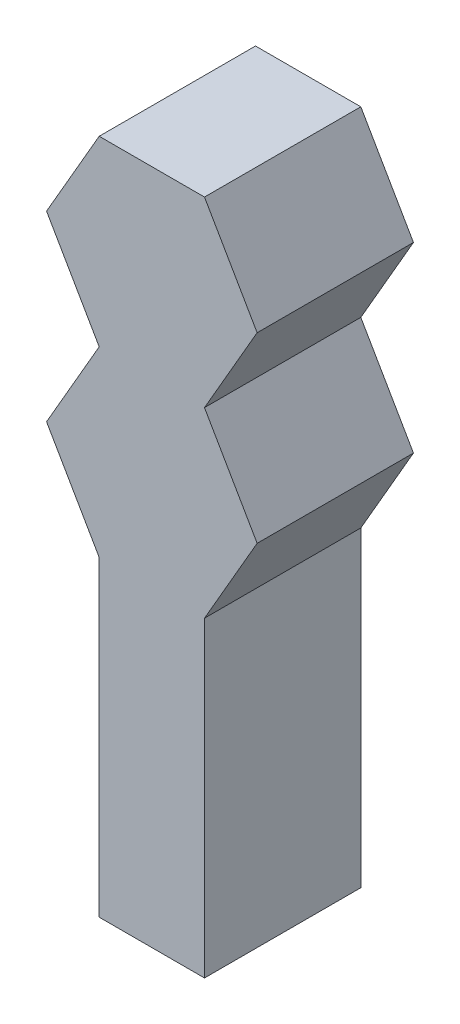
ISO-10303-21;
HEADER;
FILE_DESCRIPTION(('STEP AP214'),'2;1');
FILE_NAME('part.step','',(''),(''),'','','');
FILE_SCHEMA(('AUTOMOTIVE_DESIGN { 1 0 10303 214 1 1 1 1 }'));
ENDSEC;
DATA;
#1=APPLICATION_CONTEXT('core data for automotive mechanical design processes');
#2=APPLICATION_PROTOCOL_DEFINITION('international standard','automotive_design',2000,#1);
#3=PRODUCT_CONTEXT('',#1,'mechanical');
#4=PRODUCT('Part','Part','',(#3));
#5=PRODUCT_RELATED_PRODUCT_CATEGORY('part','',(#4));
#6=PRODUCT_DEFINITION_FORMATION('','',#4);
#7=PRODUCT_DEFINITION_CONTEXT('part definition',#1,'design');
#8=PRODUCT_DEFINITION('design','',#6,#7);
#9=PRODUCT_DEFINITION_SHAPE('','',#8);
#10=(LENGTH_UNIT() NAMED_UNIT(*) SI_UNIT(.MILLI.,.METRE.));
#11=(NAMED_UNIT(*) PLANE_ANGLE_UNIT() SI_UNIT($,.RADIAN.));
#12=(NAMED_UNIT(*) SI_UNIT($,.STERADIAN.) SOLID_ANGLE_UNIT());
#13=UNCERTAINTY_MEASURE_WITH_UNIT(LENGTH_MEASURE(1.E-05),#10,'distance_accuracy_value','');
#14=(GEOMETRIC_REPRESENTATION_CONTEXT(3) GLOBAL_UNCERTAINTY_ASSIGNED_CONTEXT((#13)) GLOBAL_UNIT_ASSIGNED_CONTEXT((#10,
#11,#12)) REPRESENTATION_CONTEXT('',''));
#15=CARTESIAN_POINT('',(0.,0.,0.));
#16=DIRECTION('',(0.,0.,1.));
#17=DIRECTION('',(1.,0.,0.));
#18=AXIS2_PLACEMENT_3D('',#15,#16,#17);
#19=CARTESIAN_POINT('',(0.,0.,3.));
#20=DIRECTION('',(1.,0.,0.));
#21=DIRECTION('',(0.,0.,-1.));
#22=AXIS2_PLACEMENT_3D('',#19,#20,#21);
#23=PLANE('',#22);
#24=DIRECTION('',(0.,-1.,0.));
#25=VECTOR('',#24,1.);
#26=CARTESIAN_POINT('',(0.,0.,0.));
#27=LINE('',#26,#25);
#28=CARTESIAN_POINT('',(0.,5.98,0.));
#29=VERTEX_POINT('',#28);
#30=CARTESIAN_POINT('',(0.,0.,0.));
#31=VERTEX_POINT('',#30);
#32=EDGE_CURVE('E159',#29,#31,#27,.T.);
#33=ORIENTED_EDGE('',*,*,#32,.T.);
#34=DIRECTION('',(0.,0.,-1.));
#35=VECTOR('',#34,1.);
#36=CARTESIAN_POINT('',(0.,0.,3.));
#37=LINE('',#36,#35);
#38=CARTESIAN_POINT('',(0.,0.,3.));
#39=VERTEX_POINT('',#38);
#40=EDGE_CURVE('E11',#39,#31,#37,.T.);
#41=ORIENTED_EDGE('',*,*,#40,.F.);
#42=DIRECTION('',(0.,-1.,0.));
#43=VECTOR('',#42,1.);
#44=CARTESIAN_POINT('',(0.,0.,3.));
#45=LINE('',#44,#43);
#46=CARTESIAN_POINT('',(0.,5.98,3.));
#47=VERTEX_POINT('',#46);
#48=EDGE_CURVE('E181',#47,#39,#45,.T.);
#49=ORIENTED_EDGE('',*,*,#48,.F.);
#50=DIRECTION('',(0.,0.,-1.));
#51=VECTOR('',#50,1.);
#52=CARTESIAN_POINT('',(0.,5.98,3.));
#53=LINE('',#52,#51);
#54=EDGE_CURVE('E155',#47,#29,#53,.T.);
#55=ORIENTED_EDGE('',*,*,#54,.T.);
#56=EDGE_LOOP('',(#33,#41,#49,#55));
#57=FACE_BOUND('',#56,.T.);
#58=ADVANCED_FACE('F39',(#57),#23,.F.);
#59=CARTESIAN_POINT('',(0.,0.,3.));
#60=DIRECTION('',(0.,1.,0.));
#61=DIRECTION('',(0.,0.,1.));
#62=AXIS2_PLACEMENT_3D('',#59,#60,#61);
#63=PLANE('',#62);
#64=DIRECTION('',(1.,0.,0.));
#65=VECTOR('',#64,1.);
#66=CARTESIAN_POINT('',(0.,0.,0.));
#67=LINE('',#66,#65);
#68=CARTESIAN_POINT('',(2.020726,0.,0.));
#69=VERTEX_POINT('',#68);
#70=EDGE_CURVE('E162',#31,#69,#67,.T.);
#71=ORIENTED_EDGE('',*,*,#70,.T.);
#72=DIRECTION('',(0.,0.,-1.));
#73=VECTOR('',#72,1.);
#74=CARTESIAN_POINT('',(2.020726,0.,3.));
#75=LINE('',#74,#73);
#76=CARTESIAN_POINT('',(2.020726,0.,3.));
#77=VERTEX_POINT('',#76);
#78=EDGE_CURVE('E47',#77,#69,#75,.T.);
#79=ORIENTED_EDGE('',*,*,#78,.F.);
#80=DIRECTION('',(1.,0.,0.));
#81=VECTOR('',#80,1.);
#82=CARTESIAN_POINT('',(0.,0.,3.));
#83=LINE('',#82,#81);
#84=EDGE_CURVE('E110',#39,#77,#83,.T.);
#85=ORIENTED_EDGE('',*,*,#84,.F.);
#86=ORIENTED_EDGE('',*,*,#40,.T.);
#87=EDGE_LOOP('',(#71,#79,#85,#86));
#88=FACE_BOUND('',#87,.T.);
#89=ADVANCED_FACE('F259',(#88),#63,.F.);
#90=CARTESIAN_POINT('',(2.020726,0.,3.));
#91=DIRECTION('',(-1.,0.,0.));
#92=DIRECTION('',(0.,-1.,0.));
#93=AXIS2_PLACEMENT_3D('',#90,#91,#92);
#94=PLANE('',#93);
#95=DIRECTION('',(0.,1.,0.));
#96=VECTOR('',#95,1.);
#97=CARTESIAN_POINT('',(2.020726,0.,0.));
#98=LINE('',#97,#96);
#99=CARTESIAN_POINT('',(2.020726,5.98,0.));
#100=VERTEX_POINT('',#99);
#101=EDGE_CURVE('E164',#69,#100,#98,.T.);
#102=ORIENTED_EDGE('',*,*,#101,.T.);
#103=DIRECTION('',(0.,0.,-1.));
#104=VECTOR('',#103,1.);
#105=CARTESIAN_POINT('',(2.020726,5.98,3.));
#106=LINE('',#105,#104);
#107=CARTESIAN_POINT('',(2.020726,5.98,3.));
#108=VERTEX_POINT('',#107);
#109=EDGE_CURVE('E200',#108,#100,#106,.T.);
#110=ORIENTED_EDGE('',*,*,#109,.F.);
#111=DIRECTION('',(0.,1.,0.));
#112=VECTOR('',#111,1.);
#113=CARTESIAN_POINT('',(2.020726,0.,3.));
#114=LINE('',#113,#112);
#115=EDGE_CURVE('E208',#77,#108,#114,.T.);
#116=ORIENTED_EDGE('',*,*,#115,.F.);
#117=ORIENTED_EDGE('',*,*,#78,.T.);
#118=EDGE_LOOP('',(#102,#110,#116,#117));
#119=FACE_BOUND('',#118,.T.);
#120=ADVANCED_FACE('F206',(#119),#94,.F.);
#121=CARTESIAN_POINT('',(2.020726,5.98,3.));
#122=DIRECTION('',(-0.866025403784439,0.499999999999999,0.));
#123=DIRECTION('',(-0.499999999999999,-0.866025403784439,0.));
#124=AXIS2_PLACEMENT_3D('',#121,#122,#123);
#125=PLANE('',#124);
#126=DIRECTION('',(0.499999999999999,0.866025403784439,0.));
#127=VECTOR('',#126,1.);
#128=CARTESIAN_POINT('',(2.020726,5.98,0.));
#129=LINE('',#128,#127);
#130=CARTESIAN_POINT('',(3.031089,7.73000005008772,0.));
#131=VERTEX_POINT('',#130);
#132=EDGE_CURVE('E166',#100,#131,#129,.T.);
#133=ORIENTED_EDGE('',*,*,#132,.T.);
#134=DIRECTION('',(0.,0.,-1.));
#135=VECTOR('',#134,1.);
#136=CARTESIAN_POINT('',(3.031089,7.73000005008772,3.));
#137=LINE('',#136,#135);
#138=CARTESIAN_POINT('',(3.031089,7.73000005008772,3.));
#139=VERTEX_POINT('',#138);
#140=EDGE_CURVE('E197',#139,#131,#137,.T.);
#141=ORIENTED_EDGE('',*,*,#140,.F.);
#142=DIRECTION('',(0.499999999999999,0.866025403784439,0.));
#143=VECTOR('',#142,1.);
#144=CARTESIAN_POINT('',(2.020726,5.98,3.));
#145=LINE('',#144,#143);
#146=EDGE_CURVE('E226',#108,#139,#145,.T.);
#147=ORIENTED_EDGE('',*,*,#146,.F.);
#148=ORIENTED_EDGE('',*,*,#109,.T.);
#149=EDGE_LOOP('',(#133,#141,#147,#148));
#150=FACE_BOUND('',#149,.T.);
#151=ADVANCED_FACE('F217',(#150),#125,.F.);
#152=CARTESIAN_POINT('',(3.031089,7.73000005008772,3.));
#153=DIRECTION('',(-0.866025403784439,-0.5,0.));
#154=DIRECTION('',(0.5,-0.866025403784439,0.));
#155=AXIS2_PLACEMENT_3D('',#152,#153,#154);
#156=PLANE('',#155);
#157=DIRECTION('',(-0.5,0.866025403784438,0.));
#158=VECTOR('',#157,1.);
#159=CARTESIAN_POINT('',(3.031089,7.73000005008772,0.));
#160=LINE('',#159,#158);
#161=CARTESIAN_POINT('',(2.020726,9.48000010017543,0.));
#162=VERTEX_POINT('',#161);
#163=EDGE_CURVE('E168',#131,#162,#160,.T.);
#164=ORIENTED_EDGE('',*,*,#163,.T.);
#165=DIRECTION('',(0.,0.,-1.));
#166=VECTOR('',#165,1.);
#167=CARTESIAN_POINT('',(2.020726,9.48000010017543,3.));
#168=LINE('',#167,#166);
#169=CARTESIAN_POINT('',(2.020726,9.48000010017543,3.));
#170=VERTEX_POINT('',#169);
#171=EDGE_CURVE('E194',#170,#162,#168,.T.);
#172=ORIENTED_EDGE('',*,*,#171,.F.);
#173=DIRECTION('',(-0.5,0.866025403784438,0.));
#174=VECTOR('',#173,1.);
#175=CARTESIAN_POINT('',(3.031089,7.73000005008772,3.));
#176=LINE('',#175,#174);
#177=EDGE_CURVE('E223',#139,#170,#176,.T.);
#178=ORIENTED_EDGE('',*,*,#177,.F.);
#179=ORIENTED_EDGE('',*,*,#140,.T.);
#180=EDGE_LOOP('',(#164,#172,#178,#179));
#181=FACE_BOUND('',#180,.T.);
#182=ADVANCED_FACE('F221',(#181),#156,.F.);
#183=CARTESIAN_POINT('',(2.020726,9.48000010017543,3.));
#184=DIRECTION('',(-0.866025403784438,0.500000000000001,0.));
#185=DIRECTION('',(-0.500000000000001,-0.866025403784438,0.));
#186=AXIS2_PLACEMENT_3D('',#183,#184,#185);
#187=PLANE('',#186);
#188=DIRECTION('',(0.500000000000001,0.866025403784438,0.));
#189=VECTOR('',#188,1.);
#190=CARTESIAN_POINT('',(2.020726,9.48000010017543,0.));
#191=LINE('',#190,#189);
#192=CARTESIAN_POINT('',(3.031089,11.2300001502631,0.));
#193=VERTEX_POINT('',#192);
#194=EDGE_CURVE('E170',#162,#193,#191,.T.);
#195=ORIENTED_EDGE('',*,*,#194,.T.);
#196=DIRECTION('',(0.,0.,-1.));
#197=VECTOR('',#196,1.);
#198=CARTESIAN_POINT('',(3.031089,11.2300001502631,3.));
#199=LINE('',#198,#197);
#200=CARTESIAN_POINT('',(3.031089,11.2300001502631,3.));
#201=VERTEX_POINT('',#200);
#202=EDGE_CURVE('E191',#201,#193,#199,.T.);
#203=ORIENTED_EDGE('',*,*,#202,.F.);
#204=DIRECTION('',(0.500000000000001,0.866025403784438,0.));
#205=VECTOR('',#204,1.);
#206=CARTESIAN_POINT('',(2.020726,9.48000010017543,3.));
#207=LINE('',#206,#205);
#208=EDGE_CURVE('E225',#170,#201,#207,.T.);
#209=ORIENTED_EDGE('',*,*,#208,.F.);
#210=ORIENTED_EDGE('',*,*,#171,.T.);
#211=EDGE_LOOP('',(#195,#203,#209,#210));
#212=FACE_BOUND('',#211,.T.);
#213=ADVANCED_FACE('F272',(#212),#187,.F.);
#214=CARTESIAN_POINT('',(3.031089,11.2300001502631,3.));
#215=DIRECTION('',(-0.866025403784439,-0.5,0.));
#216=DIRECTION('',(0.5,-0.866025403784439,0.));
#217=AXIS2_PLACEMENT_3D('',#214,#215,#216);
#218=PLANE('',#217);
#219=DIRECTION('',(-0.5,0.866025403784439,0.));
#220=VECTOR('',#219,1.);
#221=CARTESIAN_POINT('',(3.031089,11.2300001502631,0.));
#222=LINE('',#221,#220);
#223=CARTESIAN_POINT('',(2.020726,12.9800002003509,0.));
#224=VERTEX_POINT('',#223);
#225=EDGE_CURVE('E172',#193,#224,#222,.T.);
#226=ORIENTED_EDGE('',*,*,#225,.T.);
#227=DIRECTION('',(0.,0.,-1.));
#228=VECTOR('',#227,1.);
#229=CARTESIAN_POINT('',(2.020726,12.9800002003509,3.));
#230=LINE('',#229,#228);
#231=CARTESIAN_POINT('',(2.020726,12.9800002003509,3.));
#232=VERTEX_POINT('',#231);
#233=EDGE_CURVE('E188',#232,#224,#230,.T.);
#234=ORIENTED_EDGE('',*,*,#233,.F.);
#235=DIRECTION('',(-0.5,0.866025403784439,0.));
#236=VECTOR('',#235,1.);
#237=CARTESIAN_POINT('',(3.031089,11.2300001502631,3.));
#238=LINE('',#237,#236);
#239=EDGE_CURVE('E228',#201,#232,#238,.T.);
#240=ORIENTED_EDGE('',*,*,#239,.F.);
#241=ORIENTED_EDGE('',*,*,#202,.T.);
#242=EDGE_LOOP('',(#226,#234,#240,#241));
#243=FACE_BOUND('',#242,.T.);
#244=ADVANCED_FACE('F275',(#243),#218,.F.);
#245=CARTESIAN_POINT('',(2.020726,12.9800002003509,3.));
#246=DIRECTION('',(0.,-1.,0.));
#247=DIRECTION('',(0.,0.,-1.));
#248=AXIS2_PLACEMENT_3D('',#245,#246,#247);
#249=PLANE('',#248);
#250=DIRECTION('',(-1.,0.,0.));
#251=VECTOR('',#250,1.);
#252=CARTESIAN_POINT('',(2.020726,12.9800002003509,0.));
#253=LINE('',#252,#251);
#254=CARTESIAN_POINT('',(0.,12.9800002003509,0.));
#255=VERTEX_POINT('',#254);
#256=EDGE_CURVE('E174',#224,#255,#253,.T.);
#257=ORIENTED_EDGE('',*,*,#256,.T.);
#258=DIRECTION('',(0.,0.,-1.));
#259=VECTOR('',#258,1.);
#260=CARTESIAN_POINT('',(0.,12.9800002003509,3.));
#261=LINE('',#260,#259);
#262=CARTESIAN_POINT('',(0.,12.9800002003509,3.));
#263=VERTEX_POINT('',#262);
#264=EDGE_CURVE('E185',#263,#255,#261,.T.);
#265=ORIENTED_EDGE('',*,*,#264,.F.);
#266=DIRECTION('',(-1.,0.,0.));
#267=VECTOR('',#266,1.);
#268=CARTESIAN_POINT('',(2.020726,12.9800002003509,3.));
#269=LINE('',#268,#267);
#270=EDGE_CURVE('E234',#232,#263,#269,.T.);
#271=ORIENTED_EDGE('',*,*,#270,.F.);
#272=ORIENTED_EDGE('',*,*,#233,.T.);
#273=EDGE_LOOP('',(#257,#265,#271,#272));
#274=FACE_BOUND('',#273,.T.);
#275=ADVANCED_FACE('F240',(#274),#249,.F.);
#276=CARTESIAN_POINT('',(0.,12.9800002003509,3.));
#277=DIRECTION('',(0.866025403784439,-0.5,0.));
#278=DIRECTION('',(0.5,0.866025403784439,0.));
#279=AXIS2_PLACEMENT_3D('',#276,#277,#278);
#280=PLANE('',#279);
#281=DIRECTION('',(-0.5,-0.866025403784439,0.));
#282=VECTOR('',#281,1.);
#283=CARTESIAN_POINT('',(0.,12.9800002003509,0.));
#284=LINE('',#283,#282);
#285=CARTESIAN_POINT('',(-1.010363,11.2300001502631,0.));
#286=VERTEX_POINT('',#285);
#287=EDGE_CURVE('E176',#255,#286,#284,.T.);
#288=ORIENTED_EDGE('',*,*,#287,.T.);
#289=DIRECTION('',(0.,0.,-1.));
#290=VECTOR('',#289,1.);
#291=CARTESIAN_POINT('',(-1.010363,11.2300001502631,3.));
#292=LINE('',#291,#290);
#293=CARTESIAN_POINT('',(-1.010363,11.2300001502631,3.));
#294=VERTEX_POINT('',#293);
#295=EDGE_CURVE('E150',#294,#286,#292,.T.);
#296=ORIENTED_EDGE('',*,*,#295,.F.);
#297=DIRECTION('',(-0.5,-0.866025403784439,0.));
#298=VECTOR('',#297,1.);
#299=CARTESIAN_POINT('',(0.,12.9800002003509,3.));
#300=LINE('',#299,#298);
#301=EDGE_CURVE('E141',#263,#294,#300,.T.);
#302=ORIENTED_EDGE('',*,*,#301,.F.);
#303=ORIENTED_EDGE('',*,*,#264,.T.);
#304=EDGE_LOOP('',(#288,#296,#302,#303));
#305=FACE_BOUND('',#304,.T.);
#306=ADVANCED_FACE('F244',(#305),#280,.F.);
#307=CARTESIAN_POINT('',(-1.010363,11.2300001502631,3.));
#308=DIRECTION('',(0.866025403784439,0.499999999999999,0.));
#309=DIRECTION('',(-0.499999999999999,0.866025403784439,0.));
#310=AXIS2_PLACEMENT_3D('',#307,#308,#309);
#311=PLANE('',#310);
#312=DIRECTION('',(0.499999999999999,-0.866025403784439,0.));
#313=VECTOR('',#312,1.);
#314=CARTESIAN_POINT('',(-1.010363,11.2300001502631,0.));
#315=LINE('',#314,#313);
#316=CARTESIAN_POINT('',(0.,9.48000010017543,0.));
#317=VERTEX_POINT('',#316);
#318=EDGE_CURVE('E149',#286,#317,#315,.T.);
#319=ORIENTED_EDGE('',*,*,#318,.T.);
#320=DIRECTION('',(0.,0.,-1.));
#321=VECTOR('',#320,1.);
#322=CARTESIAN_POINT('',(0.,9.48000010017543,3.));
#323=LINE('',#322,#321);
#324=CARTESIAN_POINT('',(0.,9.48000010017543,3.));
#325=VERTEX_POINT('',#324);
#326=EDGE_CURVE('E146',#325,#317,#323,.T.);
#327=ORIENTED_EDGE('',*,*,#326,.F.);
#328=DIRECTION('',(0.499999999999999,-0.866025403784439,0.));
#329=VECTOR('',#328,1.);
#330=CARTESIAN_POINT('',(-1.010363,11.2300001502631,3.));
#331=LINE('',#330,#329);
#332=EDGE_CURVE('E135',#294,#325,#331,.T.);
#333=ORIENTED_EDGE('',*,*,#332,.F.);
#334=ORIENTED_EDGE('',*,*,#295,.T.);
#335=EDGE_LOOP('',(#319,#327,#333,#334));
#336=FACE_BOUND('',#335,.T.);
#337=ADVANCED_FACE('F147',(#336),#311,.F.);
#338=CARTESIAN_POINT('',(0.,9.48000010017543,3.));
#339=DIRECTION('',(0.866025403784439,-0.5,0.));
#340=DIRECTION('',(0.5,0.866025403784439,0.));
#341=AXIS2_PLACEMENT_3D('',#338,#339,#340);
#342=PLANE('',#341);
#343=DIRECTION('',(-0.5,-0.866025403784439,0.));
#344=VECTOR('',#343,1.);
#345=CARTESIAN_POINT('',(0.,9.48000010017543,0.));
#346=LINE('',#345,#344);
#347=CARTESIAN_POINT('',(-1.01036300000001,7.73000005008772,0.));
#348=VERTEX_POINT('',#347);
#349=EDGE_CURVE('E96',#317,#348,#346,.T.);
#350=ORIENTED_EDGE('',*,*,#349,.T.);
#351=DIRECTION('',(0.,0.,-1.));
#352=VECTOR('',#351,1.);
#353=CARTESIAN_POINT('',(-1.01036300000001,7.73000005008772,3.));
#354=LINE('',#353,#352);
#355=CARTESIAN_POINT('',(-1.01036300000001,7.73000005008772,3.));
#356=VERTEX_POINT('',#355);
#357=EDGE_CURVE('E151',#356,#348,#354,.T.);
#358=ORIENTED_EDGE('',*,*,#357,.F.);
#359=DIRECTION('',(-0.5,-0.866025403784439,0.));
#360=VECTOR('',#359,1.);
#361=CARTESIAN_POINT('',(0.,9.48000010017543,3.));
#362=LINE('',#361,#360);
#363=EDGE_CURVE('E139',#325,#356,#362,.T.);
#364=ORIENTED_EDGE('',*,*,#363,.F.);
#365=ORIENTED_EDGE('',*,*,#326,.T.);
#366=EDGE_LOOP('',(#350,#358,#364,#365));
#367=FACE_BOUND('',#366,.T.);
#368=ADVANCED_FACE('F153',(#367),#342,.F.);
#369=CARTESIAN_POINT('',(-1.01036300000001,7.73000005008772,3.));
#370=DIRECTION('',(0.866025403784438,0.500000000000001,0.));
#371=DIRECTION('',(-0.500000000000001,0.866025403784438,0.));
#372=AXIS2_PLACEMENT_3D('',#369,#370,#371);
#373=PLANE('',#372);
#374=DIRECTION('',(0.500000000000001,-0.866025403784438,0.));
#375=VECTOR('',#374,1.);
#376=CARTESIAN_POINT('',(-1.01036300000001,7.73000005008772,0.));
#377=LINE('',#376,#375);
#378=EDGE_CURVE('E102',#348,#29,#377,.T.);
#379=ORIENTED_EDGE('',*,*,#378,.T.);
#380=ORIENTED_EDGE('',*,*,#54,.F.);
#381=DIRECTION('',(0.500000000000001,-0.866025403784438,0.));
#382=VECTOR('',#381,1.);
#383=CARTESIAN_POINT('',(-1.01036300000001,7.73000005008772,3.));
#384=LINE('',#383,#382);
#385=EDGE_CURVE('E55',#356,#47,#384,.T.);
#386=ORIENTED_EDGE('',*,*,#385,.F.);
#387=ORIENTED_EDGE('',*,*,#357,.T.);
#388=EDGE_LOOP('',(#379,#380,#386,#387));
#389=FACE_BOUND('',#388,.T.);
#390=ADVANCED_FACE('F248',(#389),#373,.F.);
#391=CARTESIAN_POINT('',(0.,0.,3.));
#392=DIRECTION('',(0.,0.,1.));
#393=DIRECTION('',(1.,0.,0.));
#394=AXIS2_PLACEMENT_3D('',#391,#392,#393);
#395=PLANE('',#394);
#396=ORIENTED_EDGE('',*,*,#48,.T.);
#397=ORIENTED_EDGE('',*,*,#84,.T.);
#398=ORIENTED_EDGE('',*,*,#115,.T.);
#399=ORIENTED_EDGE('',*,*,#146,.T.);
#400=ORIENTED_EDGE('',*,*,#177,.T.);
#401=ORIENTED_EDGE('',*,*,#208,.T.);
#402=ORIENTED_EDGE('',*,*,#239,.T.);
#403=ORIENTED_EDGE('',*,*,#270,.T.);
#404=ORIENTED_EDGE('',*,*,#301,.T.);
#405=ORIENTED_EDGE('',*,*,#332,.T.);
#406=ORIENTED_EDGE('',*,*,#363,.T.);
#407=ORIENTED_EDGE('',*,*,#385,.T.);
#408=EDGE_LOOP('',(#396,#397,#398,#399,#400,#401,#402,#403,#404,#405,#406,#407));
#409=FACE_BOUND('',#408,.T.);
#410=ADVANCED_FACE('F137',(#409),#395,.T.);
#411=CARTESIAN_POINT('',(0.,0.,0.));
#412=DIRECTION('',(0.,0.,1.));
#413=DIRECTION('',(1.,0.,0.));
#414=AXIS2_PLACEMENT_3D('',#411,#412,#413);
#415=PLANE('',#414);
#416=ORIENTED_EDGE('',*,*,#32,.F.);
#417=ORIENTED_EDGE('',*,*,#378,.F.);
#418=ORIENTED_EDGE('',*,*,#349,.F.);
#419=ORIENTED_EDGE('',*,*,#318,.F.);
#420=ORIENTED_EDGE('',*,*,#287,.F.);
#421=ORIENTED_EDGE('',*,*,#256,.F.);
#422=ORIENTED_EDGE('',*,*,#225,.F.);
#423=ORIENTED_EDGE('',*,*,#194,.F.);
#424=ORIENTED_EDGE('',*,*,#163,.F.);
#425=ORIENTED_EDGE('',*,*,#132,.F.);
#426=ORIENTED_EDGE('',*,*,#101,.F.);
#427=ORIENTED_EDGE('',*,*,#70,.F.);
#428=EDGE_LOOP('',(#416,#417,#418,#419,#420,#421,#422,#423,#424,#425,#426,#427));
#429=FACE_BOUND('',#428,.T.);
#430=ADVANCED_FACE('F212',(#429),#415,.F.);
#431=CLOSED_SHELL('',(#58,#89,#120,#151,#182,#213,#244,#275,#306,#337,#368,#390,#410,#430));
#432=MANIFOLD_SOLID_BREP('B2',#431);
#433=ADVANCED_BREP_SHAPE_REPRESENTATION('',(#18,#432),#14);
#434=SHAPE_DEFINITION_REPRESENTATION(#9,#433);
ENDSEC;
END-ISO-10303-21;
